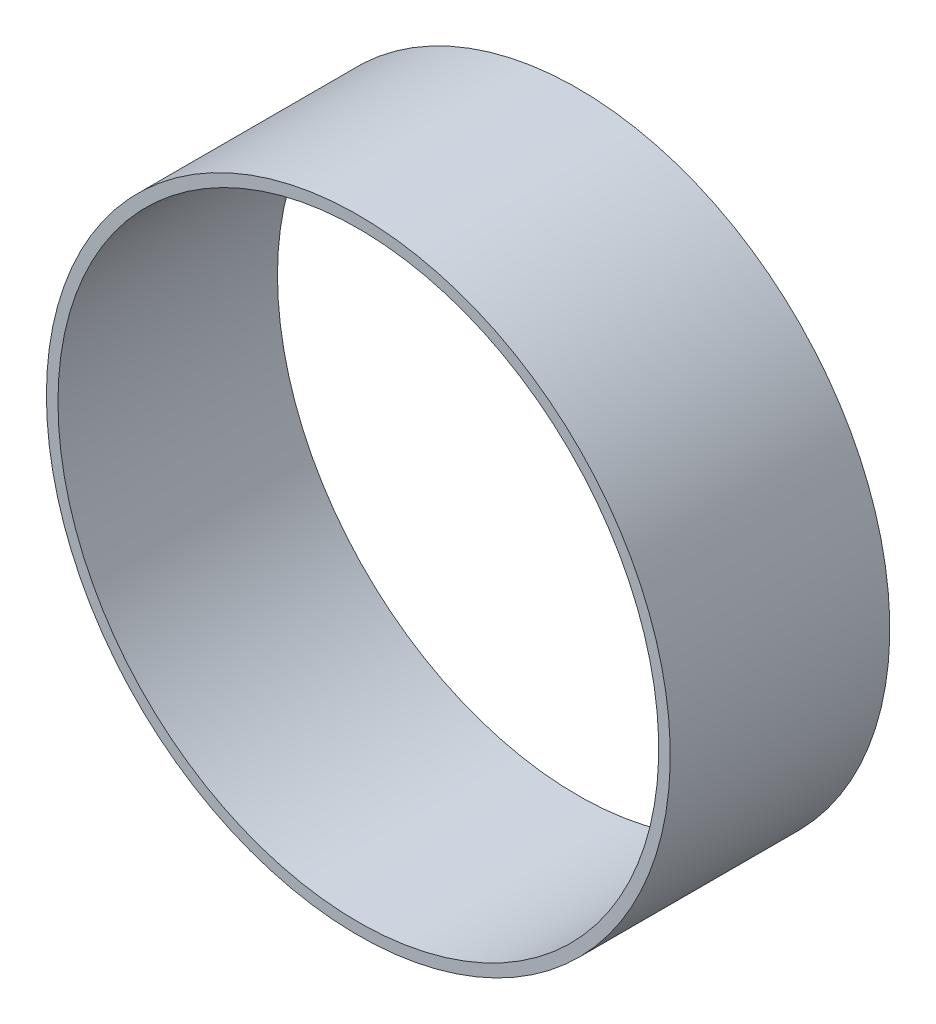
ISO-10303-21;
HEADER;
FILE_DESCRIPTION(('STEP AP214'),'2;1');
FILE_NAME('part.step','',(''),(''),'','','');
FILE_SCHEMA(('AUTOMOTIVE_DESIGN { 1 0 10303 214 1 1 1 1 }'));
ENDSEC;
DATA;
#1=APPLICATION_CONTEXT('core data for automotive mechanical design processes');
#2=APPLICATION_PROTOCOL_DEFINITION('international standard','automotive_design',2000,#1);
#3=PRODUCT_CONTEXT('',#1,'mechanical');
#4=PRODUCT('Part','Part','',(#3));
#5=PRODUCT_RELATED_PRODUCT_CATEGORY('part','',(#4));
#6=PRODUCT_DEFINITION_FORMATION('','',#4);
#7=PRODUCT_DEFINITION_CONTEXT('part definition',#1,'design');
#8=PRODUCT_DEFINITION('design','',#6,#7);
#9=PRODUCT_DEFINITION_SHAPE('','',#8);
#10=(LENGTH_UNIT() NAMED_UNIT(*) SI_UNIT(.MILLI.,.METRE.));
#11=(NAMED_UNIT(*) PLANE_ANGLE_UNIT() SI_UNIT($,.RADIAN.));
#12=(NAMED_UNIT(*) SI_UNIT($,.STERADIAN.) SOLID_ANGLE_UNIT());
#13=UNCERTAINTY_MEASURE_WITH_UNIT(LENGTH_MEASURE(1.E-05),#10,'distance_accuracy_value','');
#14=(GEOMETRIC_REPRESENTATION_CONTEXT(3) GLOBAL_UNCERTAINTY_ASSIGNED_CONTEXT((#13)) GLOBAL_UNIT_ASSIGNED_CONTEXT((#10,
#11,#12)) REPRESENTATION_CONTEXT('',''));
#15=CARTESIAN_POINT('',(0.,0.,0.));
#16=DIRECTION('',(0.,0.,1.));
#17=DIRECTION('',(1.,0.,0.));
#18=AXIS2_PLACEMENT_3D('',#15,#16,#17);
#19=CARTESIAN_POINT('',(0.,0.,-10.));
#20=DIRECTION('',(0.,0.,1.));
#21=DIRECTION('',(1.,0.,0.));
#22=AXIS2_PLACEMENT_3D('',#19,#20,#21);
#23=CYLINDRICAL_SURFACE('',#22,26.);
#24=CARTESIAN_POINT('',(0.,0.,-10.));
#25=DIRECTION('',(0.,0.,1.));
#26=DIRECTION('',(1.,0.,0.));
#27=AXIS2_PLACEMENT_3D('',#24,#25,#26);
#28=CIRCLE('',#27,26.);
#29=CARTESIAN_POINT('',(-26.,0.,-10.));
#30=VERTEX_POINT('',#29);
#31=EDGE_CURVE('E36',#30,#30,#28,.T.);
#32=ORIENTED_EDGE('',*,*,#31,.F.);
#33=DIRECTION('',(0.,0.,1.));
#34=VECTOR('',#33,1.);
#35=CARTESIAN_POINT('',(-26.,0.,-10.));
#36=LINE('',#35,#34);
#37=CARTESIAN_POINT('',(-26.,0.,9.));
#38=VERTEX_POINT('',#37);
#39=EDGE_CURVE('E11',#30,#38,#36,.T.);
#40=ORIENTED_EDGE('',*,*,#39,.T.);
#41=CARTESIAN_POINT('',(0.,0.,9.));
#42=DIRECTION('',(0.,0.,-1.));
#43=DIRECTION('',(1.,0.,0.));
#44=AXIS2_PLACEMENT_3D('',#41,#42,#43);
#45=CIRCLE('',#44,26.);
#46=EDGE_CURVE('E56',#38,#38,#45,.T.);
#47=ORIENTED_EDGE('',*,*,#46,.F.);
#48=ORIENTED_EDGE('',*,*,#39,.F.);
#49=EDGE_LOOP('',(#32,#40,#47,#48));
#50=FACE_BOUND('',#49,.T.);
#51=ADVANCED_FACE('F16',(#50),#23,.F.);
#52=CARTESIAN_POINT('',(0.,0.,-10.));
#53=DIRECTION('',(0.,0.,1.));
#54=DIRECTION('',(1.,0.,0.));
#55=AXIS2_PLACEMENT_3D('',#52,#53,#54);
#56=CYLINDRICAL_SURFACE('',#55,27.);
#57=CARTESIAN_POINT('',(0.,0.,9.));
#58=DIRECTION('',(0.,0.,1.));
#59=DIRECTION('',(1.,0.,0.));
#60=AXIS2_PLACEMENT_3D('',#57,#58,#59);
#61=CIRCLE('',#60,27.);
#62=CARTESIAN_POINT('',(-27.,0.,9.));
#63=VERTEX_POINT('',#62);
#64=EDGE_CURVE('E51',#63,#63,#61,.T.);
#65=ORIENTED_EDGE('',*,*,#64,.F.);
#66=DIRECTION('',(0.,0.,-1.));
#67=VECTOR('',#66,1.);
#68=CARTESIAN_POINT('',(-27.,0.,-10.));
#69=LINE('',#68,#67);
#70=CARTESIAN_POINT('',(-27.,0.,-10.));
#71=VERTEX_POINT('',#70);
#72=EDGE_CURVE('E26',#63,#71,#69,.T.);
#73=ORIENTED_EDGE('',*,*,#72,.T.);
#74=CARTESIAN_POINT('',(0.,0.,-10.));
#75=DIRECTION('',(0.,0.,-1.));
#76=DIRECTION('',(1.,0.,0.));
#77=AXIS2_PLACEMENT_3D('',#74,#75,#76);
#78=CIRCLE('',#77,27.);
#79=EDGE_CURVE('E62',#71,#71,#78,.T.);
#80=ORIENTED_EDGE('',*,*,#79,.F.);
#81=ORIENTED_EDGE('',*,*,#72,.F.);
#82=EDGE_LOOP('',(#65,#73,#80,#81));
#83=FACE_BOUND('',#82,.T.);
#84=ADVANCED_FACE('F52',(#83),#56,.T.);
#85=CARTESIAN_POINT('',(0.,0.,-10.));
#86=DIRECTION('',(0.,0.,-1.));
#87=DIRECTION('',(0.,-1.,0.));
#88=AXIS2_PLACEMENT_3D('',#85,#86,#87);
#89=PLANE('',#88);
#90=ORIENTED_EDGE('',*,*,#79,.T.);
#91=EDGE_LOOP('',(#90));
#92=FACE_BOUND('',#91,.T.);
#93=ORIENTED_EDGE('',*,*,#31,.T.);
#94=EDGE_LOOP('',(#93));
#95=FACE_BOUND('',#94,.T.);
#96=ADVANCED_FACE('F18',(#92,#95),#89,.T.);
#97=CARTESIAN_POINT('',(0.,0.,9.));
#98=DIRECTION('',(0.,0.,-1.));
#99=DIRECTION('',(0.,-1.,0.));
#100=AXIS2_PLACEMENT_3D('',#97,#98,#99);
#101=PLANE('',#100);
#102=ORIENTED_EDGE('',*,*,#64,.T.);
#103=EDGE_LOOP('',(#102));
#104=FACE_BOUND('',#103,.T.);
#105=ORIENTED_EDGE('',*,*,#46,.T.);
#106=EDGE_LOOP('',(#105));
#107=FACE_BOUND('',#106,.T.);
#108=ADVANCED_FACE('F89',(#104,#107),#101,.F.);
#109=CLOSED_SHELL('',(#51,#84,#96,#108));
#110=MANIFOLD_SOLID_BREP('B1',#109);
#111=ADVANCED_BREP_SHAPE_REPRESENTATION('',(#18,#110),#14);
#112=SHAPE_DEFINITION_REPRESENTATION(#9,#111);
ENDSEC;
END-ISO-10303-21;
